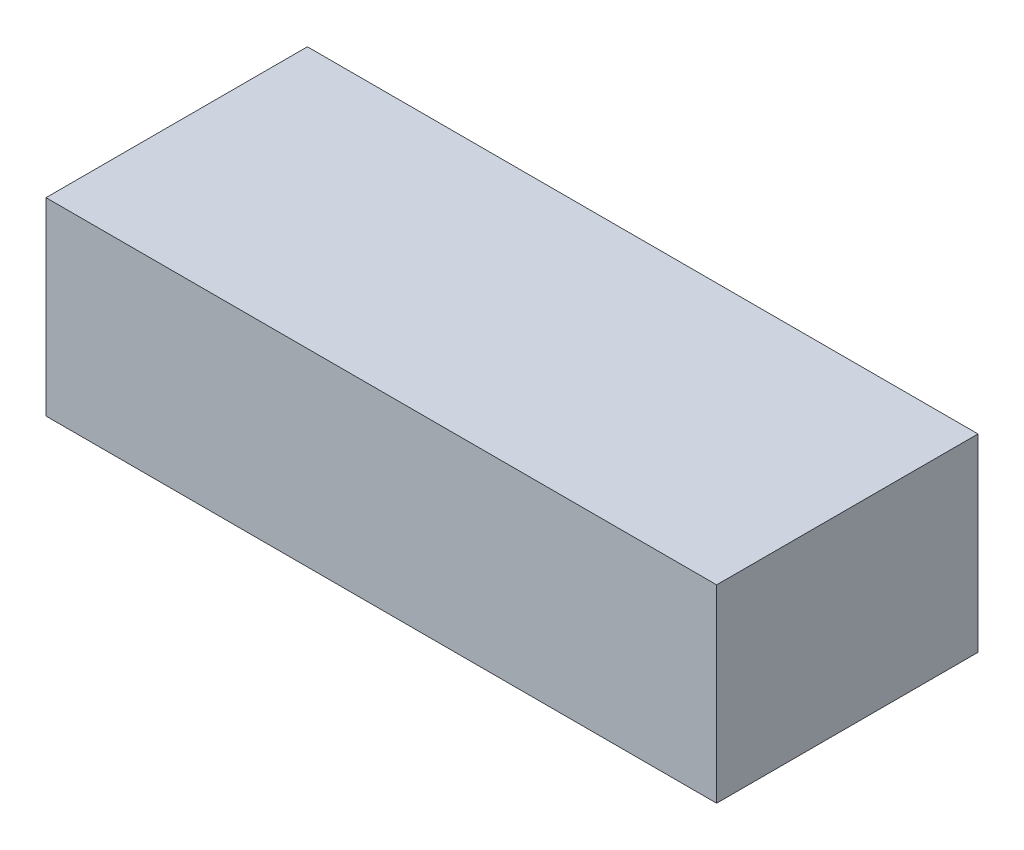
ISO-10303-21;
HEADER;
FILE_DESCRIPTION(('STEP AP214'),'2;1');
FILE_NAME('part.step','',(''),(''),'','','');
FILE_SCHEMA(('AUTOMOTIVE_DESIGN { 1 0 10303 214 1 1 1 1 }'));
ENDSEC;
DATA;
#1=APPLICATION_CONTEXT('core data for automotive mechanical design processes');
#2=APPLICATION_PROTOCOL_DEFINITION('international standard','automotive_design',2000,#1);
#3=PRODUCT_CONTEXT('',#1,'mechanical');
#4=PRODUCT('Part','Part','',(#3));
#5=PRODUCT_RELATED_PRODUCT_CATEGORY('part','',(#4));
#6=PRODUCT_DEFINITION_FORMATION('','',#4);
#7=PRODUCT_DEFINITION_CONTEXT('part definition',#1,'design');
#8=PRODUCT_DEFINITION('design','',#6,#7);
#9=PRODUCT_DEFINITION_SHAPE('','',#8);
#10=(LENGTH_UNIT() NAMED_UNIT(*) SI_UNIT(.MILLI.,.METRE.));
#11=(NAMED_UNIT(*) PLANE_ANGLE_UNIT() SI_UNIT($,.RADIAN.));
#12=(NAMED_UNIT(*) SI_UNIT($,.STERADIAN.) SOLID_ANGLE_UNIT());
#13=UNCERTAINTY_MEASURE_WITH_UNIT(LENGTH_MEASURE(1.E-05),#10,'distance_accuracy_value','');
#14=(GEOMETRIC_REPRESENTATION_CONTEXT(3) GLOBAL_UNCERTAINTY_ASSIGNED_CONTEXT((#13)) GLOBAL_UNIT_ASSIGNED_CONTEXT((#10,
#11,#12)) REPRESENTATION_CONTEXT('',''));
#15=CARTESIAN_POINT('',(0.,0.,0.));
#16=DIRECTION('',(0.,0.,1.));
#17=DIRECTION('',(1.,0.,0.));
#18=AXIS2_PLACEMENT_3D('',#15,#16,#17);
#19=CARTESIAN_POINT('',(-180.8,-52.6,197.4));
#20=DIRECTION('',(-1.,0.,0.));
#21=DIRECTION('',(0.,0.,1.));
#22=AXIS2_PLACEMENT_3D('',#19,#20,#21);
#23=PLANE('',#22);
#24=DIRECTION('',(0.,1.,0.));
#25=VECTOR('',#24,1.);
#26=CARTESIAN_POINT('',(-180.8,-52.6,197.4));
#27=LINE('',#26,#25);
#28=CARTESIAN_POINT('',(-180.8,-52.6,197.4));
#29=VERTEX_POINT('',#28);
#30=CARTESIAN_POINT('',(-180.8,-51.6,197.4));
#31=VERTEX_POINT('',#30);
#32=EDGE_CURVE('E25',#29,#31,#27,.T.);
#33=ORIENTED_EDGE('',*,*,#32,.F.);
#34=DIRECTION('',(0.,0.,1.));
#35=VECTOR('',#34,1.);
#36=CARTESIAN_POINT('',(-180.8,-52.6,197.4));
#37=LINE('',#36,#35);
#38=CARTESIAN_POINT('',(-180.8,-52.6,202.6));
#39=VERTEX_POINT('',#38);
#40=EDGE_CURVE('E9',#29,#39,#37,.T.);
#41=ORIENTED_EDGE('',*,*,#40,.T.);
#42=DIRECTION('',(0.,1.,0.));
#43=VECTOR('',#42,1.);
#44=CARTESIAN_POINT('',(-180.8,-52.6,202.6));
#45=LINE('',#44,#43);
#46=CARTESIAN_POINT('',(-180.8,-51.6,202.6));
#47=VERTEX_POINT('',#46);
#48=EDGE_CURVE('E100',#39,#47,#45,.T.);
#49=ORIENTED_EDGE('',*,*,#48,.T.);
#50=DIRECTION('',(0.,0.,1.));
#51=VECTOR('',#50,1.);
#52=CARTESIAN_POINT('',(-180.8,-51.6,197.4));
#53=LINE('',#52,#51);
#54=EDGE_CURVE('E94',#31,#47,#53,.T.);
#55=ORIENTED_EDGE('',*,*,#54,.F.);
#56=EDGE_LOOP('',(#33,#41,#49,#55));
#57=FACE_BOUND('',#56,.T.);
#58=ADVANCED_FACE('F14',(#57),#23,.T.);
#59=CARTESIAN_POINT('',(-180.8,-52.6,197.4));
#60=DIRECTION('',(0.,1.,0.));
#61=DIRECTION('',(1.,0.,0.));
#62=AXIS2_PLACEMENT_3D('',#59,#60,#61);
#63=PLANE('',#62);
#64=DIRECTION('',(-1.,0.,0.));
#65=VECTOR('',#64,1.);
#66=CARTESIAN_POINT('',(-180.8,-52.6,202.6));
#67=LINE('',#66,#65);
#68=CARTESIAN_POINT('',(-187.4,-52.6,202.6));
#69=VERTEX_POINT('',#68);
#70=EDGE_CURVE('E113',#39,#69,#67,.T.);
#71=ORIENTED_EDGE('',*,*,#70,.F.);
#72=ORIENTED_EDGE('',*,*,#40,.F.);
#73=DIRECTION('',(-1.,0.,0.));
#74=VECTOR('',#73,1.);
#75=CARTESIAN_POINT('',(-180.8,-52.6,197.4));
#76=LINE('',#75,#74);
#77=CARTESIAN_POINT('',(-187.4,-52.6,197.4));
#78=VERTEX_POINT('',#77);
#79=EDGE_CURVE('E131',#29,#78,#76,.T.);
#80=ORIENTED_EDGE('',*,*,#79,.T.);
#81=DIRECTION('',(0.,0.,-1.));
#82=VECTOR('',#81,1.);
#83=CARTESIAN_POINT('',(-187.4,-52.6,196.8));
#84=LINE('',#83,#82);
#85=EDGE_CURVE('E116',#69,#78,#84,.T.);
#86=ORIENTED_EDGE('',*,*,#85,.F.);
#87=EDGE_LOOP('',(#71,#72,#80,#86));
#88=FACE_BOUND('',#87,.T.);
#89=ADVANCED_FACE('F265',(#88),#63,.T.);
#90=CARTESIAN_POINT('',(-180.8,-52.6,197.4));
#91=DIRECTION('',(0.,0.,1.));
#92=DIRECTION('',(1.,0.,0.));
#93=AXIS2_PLACEMENT_3D('',#90,#91,#92);
#94=PLANE('',#93);
#95=ORIENTED_EDGE('',*,*,#79,.F.);
#96=ORIENTED_EDGE('',*,*,#32,.T.);
#97=DIRECTION('',(-1.,0.,0.));
#98=VECTOR('',#97,1.);
#99=CARTESIAN_POINT('',(-180.8,-51.6,197.4));
#100=LINE('',#99,#98);
#101=CARTESIAN_POINT('',(-187.4,-51.6,197.4));
#102=VERTEX_POINT('',#101);
#103=EDGE_CURVE('E18',#31,#102,#100,.T.);
#104=ORIENTED_EDGE('',*,*,#103,.T.);
#105=DIRECTION('',(0.,1.,0.));
#106=VECTOR('',#105,1.);
#107=CARTESIAN_POINT('',(-187.4,-53.725,197.4));
#108=LINE('',#107,#106);
#109=EDGE_CURVE('E109',#78,#102,#108,.T.);
#110=ORIENTED_EDGE('',*,*,#109,.F.);
#111=EDGE_LOOP('',(#95,#96,#104,#110));
#112=FACE_BOUND('',#111,.T.);
#113=ADVANCED_FACE('F196',(#112),#94,.T.);
#114=CARTESIAN_POINT('',(-180.8,-51.6,197.4));
#115=DIRECTION('',(0.,1.,0.));
#116=DIRECTION('',(1.,0.,0.));
#117=AXIS2_PLACEMENT_3D('',#114,#115,#116);
#118=PLANE('',#117);
#119=DIRECTION('',(0.,0.,-1.));
#120=VECTOR('',#119,1.);
#121=CARTESIAN_POINT('',(-187.4,-51.6,196.8));
#122=LINE('',#121,#120);
#123=CARTESIAN_POINT('',(-187.4,-51.6,202.6));
#124=VERTEX_POINT('',#123);
#125=EDGE_CURVE('E91',#124,#102,#122,.T.);
#126=ORIENTED_EDGE('',*,*,#125,.T.);
#127=ORIENTED_EDGE('',*,*,#103,.F.);
#128=ORIENTED_EDGE('',*,*,#54,.T.);
#129=DIRECTION('',(-1.,0.,0.));
#130=VECTOR('',#129,1.);
#131=CARTESIAN_POINT('',(-180.8,-51.6,202.6));
#132=LINE('',#131,#130);
#133=EDGE_CURVE('E88',#47,#124,#132,.T.);
#134=ORIENTED_EDGE('',*,*,#133,.T.);
#135=EDGE_LOOP('',(#126,#127,#128,#134));
#136=FACE_BOUND('',#135,.T.);
#137=ADVANCED_FACE('F16',(#136),#118,.F.);
#138=CARTESIAN_POINT('',(-180.8,-52.6,202.6));
#139=DIRECTION('',(0.,0.,1.));
#140=DIRECTION('',(1.,0.,0.));
#141=AXIS2_PLACEMENT_3D('',#138,#139,#140);
#142=PLANE('',#141);
#143=DIRECTION('',(0.,1.,0.));
#144=VECTOR('',#143,1.);
#145=CARTESIAN_POINT('',(-187.4,-53.725,202.6));
#146=LINE('',#145,#144);
#147=EDGE_CURVE('E107',#69,#124,#146,.T.);
#148=ORIENTED_EDGE('',*,*,#147,.T.);
#149=ORIENTED_EDGE('',*,*,#133,.F.);
#150=ORIENTED_EDGE('',*,*,#48,.F.);
#151=ORIENTED_EDGE('',*,*,#70,.T.);
#152=EDGE_LOOP('',(#148,#149,#150,#151));
#153=FACE_BOUND('',#152,.T.);
#154=ADVANCED_FACE('F112',(#153),#142,.F.);
#155=CARTESIAN_POINT('',(-167.9,-49.35,196.2));
#156=DIRECTION('',(0.,1.,0.));
#157=DIRECTION('',(1.,0.,0.));
#158=AXIS2_PLACEMENT_3D('',#155,#156,#157);
#159=PLANE('',#158);
#160=DIRECTION('',(0.,0.,1.));
#161=VECTOR('',#160,1.);
#162=CARTESIAN_POINT('',(-167.9,-49.35,196.2));
#163=LINE('',#162,#161);
#164=CARTESIAN_POINT('',(-167.9,-49.35,196.2));
#165=VERTEX_POINT('',#164);
#166=CARTESIAN_POINT('',(-167.9,-49.35,203.8));
#167=VERTEX_POINT('',#166);
#168=EDGE_CURVE('E138',#165,#167,#163,.T.);
#169=ORIENTED_EDGE('',*,*,#168,.F.);
#170=DIRECTION('',(-1.,0.,0.));
#171=VECTOR('',#170,1.);
#172=CARTESIAN_POINT('',(-167.9,-49.35,196.2));
#173=LINE('',#172,#171);
#174=CARTESIAN_POINT('',(-187.4,-49.35,196.2));
#175=VERTEX_POINT('',#174);
#176=EDGE_CURVE('E101',#165,#175,#173,.T.);
#177=ORIENTED_EDGE('',*,*,#176,.T.);
#178=DIRECTION('',(0.,0.,1.));
#179=VECTOR('',#178,1.);
#180=CARTESIAN_POINT('',(-187.4,-49.35,196.2));
#181=LINE('',#180,#179);
#182=CARTESIAN_POINT('',(-187.4,-49.35,203.8));
#183=VERTEX_POINT('',#182);
#184=EDGE_CURVE('E117',#175,#183,#181,.T.);
#185=ORIENTED_EDGE('',*,*,#184,.T.);
#186=DIRECTION('',(-1.,0.,0.));
#187=VECTOR('',#186,1.);
#188=CARTESIAN_POINT('',(-167.9,-49.35,203.8));
#189=LINE('',#188,#187);
#190=EDGE_CURVE('E143',#167,#183,#189,.T.);
#191=ORIENTED_EDGE('',*,*,#190,.F.);
#192=EDGE_LOOP('',(#169,#177,#185,#191));
#193=FACE_BOUND('',#192,.T.);
#194=ADVANCED_FACE('F204',(#193),#159,.T.);
#195=CARTESIAN_POINT('',(-167.9,-54.85,196.2));
#196=DIRECTION('',(0.,0.,1.));
#197=DIRECTION('',(1.,0.,0.));
#198=AXIS2_PLACEMENT_3D('',#195,#196,#197);
#199=PLANE('',#198);
#200=DIRECTION('',(0.,1.,0.));
#201=VECTOR('',#200,1.);
#202=CARTESIAN_POINT('',(-187.4,-54.85,196.2));
#203=LINE('',#202,#201);
#204=CARTESIAN_POINT('',(-187.4,-54.85,196.2));
#205=VERTEX_POINT('',#204);
#206=EDGE_CURVE('E124',#205,#175,#203,.T.);
#207=ORIENTED_EDGE('',*,*,#206,.T.);
#208=ORIENTED_EDGE('',*,*,#176,.F.);
#209=DIRECTION('',(0.,1.,0.));
#210=VECTOR('',#209,1.);
#211=CARTESIAN_POINT('',(-167.9,-54.85,196.2));
#212=LINE('',#211,#210);
#213=CARTESIAN_POINT('',(-167.9,-54.85,196.2));
#214=VERTEX_POINT('',#213);
#215=EDGE_CURVE('E140',#214,#165,#212,.T.);
#216=ORIENTED_EDGE('',*,*,#215,.F.);
#217=DIRECTION('',(-1.,0.,0.));
#218=VECTOR('',#217,1.);
#219=CARTESIAN_POINT('',(-167.9,-54.85,196.2));
#220=LINE('',#219,#218);
#221=EDGE_CURVE('E139',#214,#205,#220,.T.);
#222=ORIENTED_EDGE('',*,*,#221,.T.);
#223=EDGE_LOOP('',(#207,#208,#216,#222));
#224=FACE_BOUND('',#223,.T.);
#225=ADVANCED_FACE('F210',(#224),#199,.F.);
#226=CARTESIAN_POINT('',(-187.4,-54.85,196.2));
#227=DIRECTION('',(-1.,0.,0.));
#228=DIRECTION('',(0.,0.,1.));
#229=AXIS2_PLACEMENT_3D('',#226,#227,#228);
#230=PLANE('',#229);
#231=ORIENTED_EDGE('',*,*,#147,.F.);
#232=ORIENTED_EDGE('',*,*,#85,.T.);
#233=ORIENTED_EDGE('',*,*,#109,.T.);
#234=ORIENTED_EDGE('',*,*,#125,.F.);
#235=EDGE_LOOP('',(#231,#232,#233,#234));
#236=FACE_BOUND('',#235,.T.);
#237=ORIENTED_EDGE('',*,*,#206,.F.);
#238=DIRECTION('',(0.,0.,1.));
#239=VECTOR('',#238,1.);
#240=CARTESIAN_POINT('',(-187.4,-54.85,196.2));
#241=LINE('',#240,#239);
#242=CARTESIAN_POINT('',(-187.4,-54.85,203.8));
#243=VERTEX_POINT('',#242);
#244=EDGE_CURVE('E173',#205,#243,#241,.T.);
#245=ORIENTED_EDGE('',*,*,#244,.T.);
#246=DIRECTION('',(0.,1.,0.));
#247=VECTOR('',#246,1.);
#248=CARTESIAN_POINT('',(-187.4,-54.85,203.8));
#249=LINE('',#248,#247);
#250=EDGE_CURVE('E153',#243,#183,#249,.T.);
#251=ORIENTED_EDGE('',*,*,#250,.T.);
#252=ORIENTED_EDGE('',*,*,#184,.F.);
#253=EDGE_LOOP('',(#237,#245,#251,#252));
#254=FACE_BOUND('',#253,.T.);
#255=ADVANCED_FACE('F104',(#236,#254),#230,.T.);
#256=CARTESIAN_POINT('',(-167.9,-54.85,203.8));
#257=DIRECTION('',(0.,0.,1.));
#258=DIRECTION('',(1.,0.,0.));
#259=AXIS2_PLACEMENT_3D('',#256,#257,#258);
#260=PLANE('',#259);
#261=DIRECTION('',(-1.,0.,0.));
#262=VECTOR('',#261,1.);
#263=CARTESIAN_POINT('',(-167.9,-54.85,203.8));
#264=LINE('',#263,#262);
#265=CARTESIAN_POINT('',(-167.9,-54.85,203.8));
#266=VERTEX_POINT('',#265);
#267=EDGE_CURVE('E170',#266,#243,#264,.T.);
#268=ORIENTED_EDGE('',*,*,#267,.F.);
#269=DIRECTION('',(0.,1.,0.));
#270=VECTOR('',#269,1.);
#271=CARTESIAN_POINT('',(-167.9,-54.85,203.8));
#272=LINE('',#271,#270);
#273=EDGE_CURVE('E144',#266,#167,#272,.T.);
#274=ORIENTED_EDGE('',*,*,#273,.T.);
#275=ORIENTED_EDGE('',*,*,#190,.T.);
#276=ORIENTED_EDGE('',*,*,#250,.F.);
#277=EDGE_LOOP('',(#268,#274,#275,#276));
#278=FACE_BOUND('',#277,.T.);
#279=ADVANCED_FACE('F227',(#278),#260,.T.);
#280=CARTESIAN_POINT('',(-167.9,-54.85,196.2));
#281=DIRECTION('',(-1.,0.,0.));
#282=DIRECTION('',(0.,0.,1.));
#283=AXIS2_PLACEMENT_3D('',#280,#281,#282);
#284=PLANE('',#283);
#285=ORIENTED_EDGE('',*,*,#168,.T.);
#286=ORIENTED_EDGE('',*,*,#273,.F.);
#287=DIRECTION('',(0.,0.,1.));
#288=VECTOR('',#287,1.);
#289=CARTESIAN_POINT('',(-167.9,-54.85,196.2));
#290=LINE('',#289,#288);
#291=EDGE_CURVE('E134',#214,#266,#290,.T.);
#292=ORIENTED_EDGE('',*,*,#291,.F.);
#293=ORIENTED_EDGE('',*,*,#215,.T.);
#294=EDGE_LOOP('',(#285,#286,#292,#293));
#295=FACE_BOUND('',#294,.T.);
#296=ADVANCED_FACE('F221',(#295),#284,.F.);
#297=CARTESIAN_POINT('',(-167.9,-54.85,196.2));
#298=DIRECTION('',(0.,1.,0.));
#299=DIRECTION('',(1.,0.,0.));
#300=AXIS2_PLACEMENT_3D('',#297,#298,#299);
#301=PLANE('',#300);
#302=ORIENTED_EDGE('',*,*,#267,.T.);
#303=ORIENTED_EDGE('',*,*,#244,.F.);
#304=ORIENTED_EDGE('',*,*,#221,.F.);
#305=ORIENTED_EDGE('',*,*,#291,.T.);
#306=EDGE_LOOP('',(#302,#303,#304,#305));
#307=FACE_BOUND('',#306,.T.);
#308=ADVANCED_FACE('F226',(#307),#301,.F.);
#309=CLOSED_SHELL('',(#58,#89,#113,#137,#154,#194,#225,#255,#279,#296,#308));
#310=MANIFOLD_SOLID_BREP('B1',#309);
#311=ADVANCED_BREP_SHAPE_REPRESENTATION('',(#18,#310),#14);
#312=SHAPE_DEFINITION_REPRESENTATION(#9,#311);
ENDSEC;
END-ISO-10303-21;
